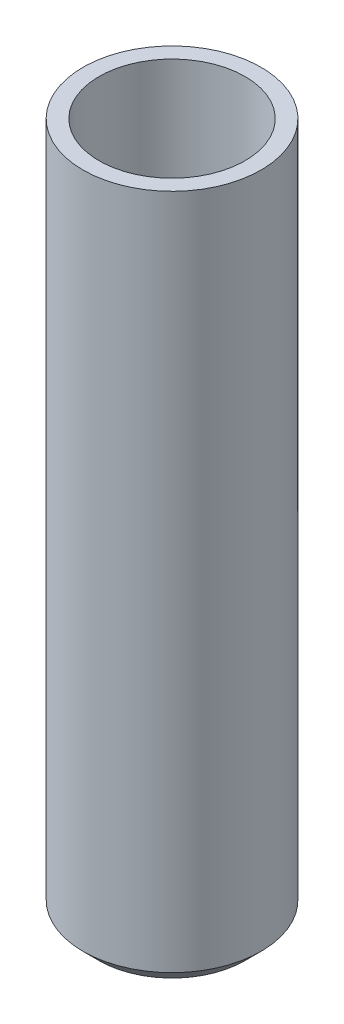
ISO-10303-21;
HEADER;
FILE_DESCRIPTION(('STEP AP214'),'2;1');
FILE_NAME('part.step','',(''),(''),'','','');
FILE_SCHEMA(('AUTOMOTIVE_DESIGN { 1 0 10303 214 1 1 1 1 }'));
ENDSEC;
DATA;
#1=APPLICATION_CONTEXT('core data for automotive mechanical design processes');
#2=APPLICATION_PROTOCOL_DEFINITION('international standard','automotive_design',2000,#1);
#3=PRODUCT_CONTEXT('',#1,'mechanical');
#4=PRODUCT('Part','Part','',(#3));
#5=PRODUCT_RELATED_PRODUCT_CATEGORY('part','',(#4));
#6=PRODUCT_DEFINITION_FORMATION('','',#4);
#7=PRODUCT_DEFINITION_CONTEXT('part definition',#1,'design');
#8=PRODUCT_DEFINITION('design','',#6,#7);
#9=PRODUCT_DEFINITION_SHAPE('','',#8);
#10=(LENGTH_UNIT() NAMED_UNIT(*) SI_UNIT(.MILLI.,.METRE.));
#11=(NAMED_UNIT(*) PLANE_ANGLE_UNIT() SI_UNIT($,.RADIAN.));
#12=(NAMED_UNIT(*) SI_UNIT($,.STERADIAN.) SOLID_ANGLE_UNIT());
#13=UNCERTAINTY_MEASURE_WITH_UNIT(LENGTH_MEASURE(1.E-05),#10,'distance_accuracy_value','');
#14=(GEOMETRIC_REPRESENTATION_CONTEXT(3) GLOBAL_UNCERTAINTY_ASSIGNED_CONTEXT((#13)) GLOBAL_UNIT_ASSIGNED_CONTEXT((#10,
#11,#12)) REPRESENTATION_CONTEXT('',''));
#15=CARTESIAN_POINT('',(0.,0.,0.));
#16=DIRECTION('',(0.,0.,1.));
#17=DIRECTION('',(1.,0.,0.));
#18=AXIS2_PLACEMENT_3D('',#15,#16,#17);
#19=CARTESIAN_POINT('',(0.,20.,0.));
#20=DIRECTION('',(0.,-1.,0.));
#21=DIRECTION('',(0.,0.,-1.));
#22=AXIS2_PLACEMENT_3D('',#19,#20,#21);
#23=CYLINDRICAL_SURFACE('',#22,2.5);
#24=CARTESIAN_POINT('',(0.,1.00000000000002,0.));
#25=DIRECTION('',(0.,1.,0.));
#26=DIRECTION('',(0.,0.,1.));
#27=AXIS2_PLACEMENT_3D('',#24,#25,#26);
#28=CIRCLE('',#27,2.5);
#29=CARTESIAN_POINT('',(0.,1.00000000000002,2.5));
#30=VERTEX_POINT('',#29);
#31=EDGE_CURVE('E40',#30,#30,#28,.T.);
#32=ORIENTED_EDGE('',*,*,#31,.T.);
#33=EDGE_LOOP('',(#32));
#34=FACE_BOUND('',#33,.T.);
#35=CARTESIAN_POINT('',(0.,20.,0.));
#36=DIRECTION('',(0.,1.,0.));
#37=DIRECTION('',(0.,0.,1.));
#38=AXIS2_PLACEMENT_3D('',#35,#36,#37);
#39=CIRCLE('',#38,2.5);
#40=CARTESIAN_POINT('',(0.,20.,2.5));
#41=VERTEX_POINT('',#40);
#42=EDGE_CURVE('E44',#41,#41,#39,.T.);
#43=ORIENTED_EDGE('',*,*,#42,.F.);
#44=EDGE_LOOP('',(#43));
#45=FACE_BOUND('',#44,.T.);
#46=ADVANCED_FACE('F33',(#34,#45),#23,.T.);
#47=CARTESIAN_POINT('',(0.,20.,0.));
#48=DIRECTION('',(0.,1.,0.));
#49=DIRECTION('',(0.,0.,1.));
#50=AXIS2_PLACEMENT_3D('',#47,#48,#49);
#51=PLANE('',#50);
#52=CARTESIAN_POINT('',(0.,20.,0.));
#53=DIRECTION('',(0.,-1.,0.));
#54=DIRECTION('',(0.,0.,-1.));
#55=AXIS2_PLACEMENT_3D('',#52,#53,#54);
#56=CIRCLE('',#55,2.05);
#57=CARTESIAN_POINT('',(0.,20.,-2.05));
#58=VERTEX_POINT('',#57);
#59=EDGE_CURVE('E48',#58,#58,#56,.T.);
#60=ORIENTED_EDGE('',*,*,#59,.T.);
#61=EDGE_LOOP('',(#60));
#62=FACE_BOUND('',#61,.T.);
#63=ORIENTED_EDGE('',*,*,#42,.T.);
#64=EDGE_LOOP('',(#63));
#65=FACE_BOUND('',#64,.T.);
#66=ADVANCED_FACE('F54',(#62,#65),#51,.T.);
#67=CARTESIAN_POINT('',(0.,20.,0.));
#68=DIRECTION('',(0.,-1.,0.));
#69=DIRECTION('',(0.,0.,-1.));
#70=AXIS2_PLACEMENT_3D('',#67,#68,#69);
#71=CYLINDRICAL_SURFACE('',#70,2.05);
#72=CARTESIAN_POINT('',(0.,0.550000000000013,0.));
#73=DIRECTION('',(0.,1.,0.));
#74=DIRECTION('',(0.,0.,1.));
#75=AXIS2_PLACEMENT_3D('',#72,#73,#74);
#76=CIRCLE('',#75,2.05);
#77=CARTESIAN_POINT('',(0.,0.550000000000013,2.05));
#78=VERTEX_POINT('',#77);
#79=EDGE_CURVE('E10',#78,#78,#76,.F.);
#80=ORIENTED_EDGE('',*,*,#79,.T.);
#81=EDGE_LOOP('',(#80));
#82=FACE_BOUND('',#81,.T.);
#83=ORIENTED_EDGE('',*,*,#59,.F.);
#84=EDGE_LOOP('',(#83));
#85=FACE_BOUND('',#84,.T.);
#86=ADVANCED_FACE('F57',(#82,#85),#71,.F.);
#87=CARTESIAN_POINT('',(0.,1.00000000000002,0.));
#88=DIRECTION('',(0.,1.,0.));
#89=DIRECTION('',(0.,0.,1.));
#90=AXIS2_PLACEMENT_3D('',#87,#88,#89);
#91=CONICAL_SURFACE('',#90,2.5,0.785398163397443);
#92=ORIENTED_EDGE('',*,*,#79,.F.);
#93=EDGE_LOOP('',(#92));
#94=FACE_BOUND('',#93,.T.);
#95=ORIENTED_EDGE('',*,*,#31,.F.);
#96=EDGE_LOOP('',(#95));
#97=FACE_BOUND('',#96,.T.);
#98=ADVANCED_FACE('F35',(#94,#97),#91,.T.);
#99=CLOSED_SHELL('',(#46,#66,#86,#98));
#100=MANIFOLD_SOLID_BREP('B2',#99);
#101=ADVANCED_BREP_SHAPE_REPRESENTATION('',(#18,#100),#14);
#102=SHAPE_DEFINITION_REPRESENTATION(#9,#101);
ENDSEC;
END-ISO-10303-21;
